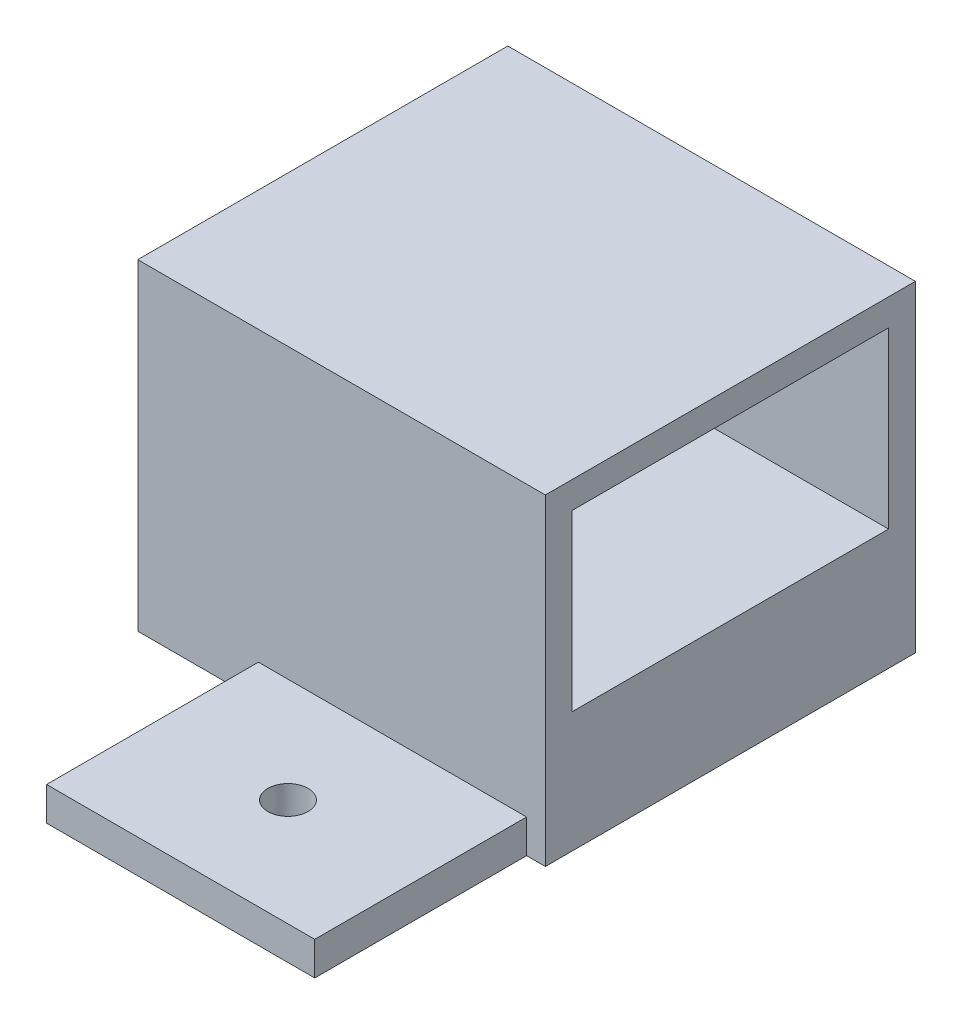
ISO-10303-21;
HEADER;
FILE_DESCRIPTION(('STEP AP214'),'2;1');
FILE_NAME('part.step','',(''),(''),'','','');
FILE_SCHEMA(('AUTOMOTIVE_DESIGN { 1 0 10303 214 1 1 1 1 }'));
ENDSEC;
DATA;
#1=APPLICATION_CONTEXT('core data for automotive mechanical design processes');
#2=APPLICATION_PROTOCOL_DEFINITION('international standard','automotive_design',2000,#1);
#3=PRODUCT_CONTEXT('',#1,'mechanical');
#4=PRODUCT('Part','Part','',(#3));
#5=PRODUCT_RELATED_PRODUCT_CATEGORY('part','',(#4));
#6=PRODUCT_DEFINITION_FORMATION('','',#4);
#7=PRODUCT_DEFINITION_CONTEXT('part definition',#1,'design');
#8=PRODUCT_DEFINITION('design','',#6,#7);
#9=PRODUCT_DEFINITION_SHAPE('','',#8);
#10=(LENGTH_UNIT() NAMED_UNIT(*) SI_UNIT(.MILLI.,.METRE.));
#11=(NAMED_UNIT(*) PLANE_ANGLE_UNIT() SI_UNIT($,.RADIAN.));
#12=(NAMED_UNIT(*) SI_UNIT($,.STERADIAN.) SOLID_ANGLE_UNIT());
#13=UNCERTAINTY_MEASURE_WITH_UNIT(LENGTH_MEASURE(1.E-05),#10,'distance_accuracy_value','');
#14=(GEOMETRIC_REPRESENTATION_CONTEXT(3) GLOBAL_UNCERTAINTY_ASSIGNED_CONTEXT((#13)) GLOBAL_UNIT_ASSIGNED_CONTEXT((#10,
#11,#12)) REPRESENTATION_CONTEXT('',''));
#15=CARTESIAN_POINT('',(0.,0.,0.));
#16=DIRECTION('',(0.,0.,1.));
#17=DIRECTION('',(1.,0.,0.));
#18=AXIS2_PLACEMENT_3D('',#15,#16,#17);
#19=CARTESIAN_POINT('',(0.,0.,-35.4));
#20=DIRECTION('',(0.,0.,1.));
#21=DIRECTION('',(1.,0.,0.));
#22=AXIS2_PLACEMENT_3D('',#19,#20,#21);
#23=PLANE('',#22);
#24=DIRECTION('',(0.,-1.,0.));
#25=VECTOR('',#24,1.);
#26=CARTESIAN_POINT('',(-19.,25.5,-35.4));
#27=LINE('',#26,#25);
#28=CARTESIAN_POINT('',(-19.,25.5,-35.4));
#29=VERTEX_POINT('',#28);
#30=CARTESIAN_POINT('',(-19.,1.5,-35.4));
#31=VERTEX_POINT('',#30);
#32=EDGE_CURVE('E198',#29,#31,#27,.T.);
#33=ORIENTED_EDGE('',*,*,#32,.F.);
#34=DIRECTION('',(-1.,0.,0.));
#35=VECTOR('',#34,1.);
#36=CARTESIAN_POINT('',(11.4,25.5,-35.4));
#37=LINE('',#36,#35);
#38=CARTESIAN_POINT('',(11.4,25.5,-35.4));
#39=VERTEX_POINT('',#38);
#40=EDGE_CURVE('E203',#39,#29,#37,.T.);
#41=ORIENTED_EDGE('',*,*,#40,.F.);
#42=DIRECTION('',(0.,1.,0.));
#43=VECTOR('',#42,1.);
#44=CARTESIAN_POINT('',(11.4,1.5,-35.4));
#45=LINE('',#44,#43);
#46=CARTESIAN_POINT('',(11.4,1.5,-35.4));
#47=VERTEX_POINT('',#46);
#48=EDGE_CURVE('E213',#47,#39,#45,.T.);
#49=ORIENTED_EDGE('',*,*,#48,.F.);
#50=DIRECTION('',(1.,0.,0.));
#51=VECTOR('',#50,1.);
#52=CARTESIAN_POINT('',(-19.,1.5,-35.4));
#53=LINE('',#52,#51);
#54=EDGE_CURVE('E211',#31,#47,#53,.T.);
#55=ORIENTED_EDGE('',*,*,#54,.F.);
#56=EDGE_LOOP('',(#33,#41,#49,#55));
#57=FACE_BOUND('',#56,.T.);
#58=DIRECTION('',(0.,1.,0.));
#59=VECTOR('',#58,1.);
#60=CARTESIAN_POINT('',(-15.,0.,-35.4));
#61=LINE('',#60,#59);
#62=CARTESIAN_POINT('',(-15.,4.5,-35.4));
#63=VERTEX_POINT('',#62);
#64=CARTESIAN_POINT('',(-15.,8.5,-35.4));
#65=VERTEX_POINT('',#64);
#66=EDGE_CURVE('E11',#63,#65,#61,.T.);
#67=ORIENTED_EDGE('',*,*,#66,.F.);
#68=DIRECTION('',(-1.,0.,0.));
#69=VECTOR('',#68,1.);
#70=CARTESIAN_POINT('',(0.,4.5,-35.4));
#71=LINE('',#70,#69);
#72=CARTESIAN_POINT('',(8.,4.5,-35.4));
#73=VERTEX_POINT('',#72);
#74=EDGE_CURVE('E48',#73,#63,#71,.T.);
#75=ORIENTED_EDGE('',*,*,#74,.F.);
#76=DIRECTION('',(0.,-1.,0.));
#77=VECTOR('',#76,1.);
#78=CARTESIAN_POINT('',(8.,0.,-35.4));
#79=LINE('',#78,#77);
#80=CARTESIAN_POINT('',(8.,8.5,-35.4));
#81=VERTEX_POINT('',#80);
#82=EDGE_CURVE('E267',#81,#73,#79,.T.);
#83=ORIENTED_EDGE('',*,*,#82,.F.);
#84=DIRECTION('',(1.,0.,0.));
#85=VECTOR('',#84,1.);
#86=CARTESIAN_POINT('',(0.,8.5,-35.4));
#87=LINE('',#86,#85);
#88=EDGE_CURVE('E270',#65,#81,#87,.T.);
#89=ORIENTED_EDGE('',*,*,#88,.F.);
#90=EDGE_LOOP('',(#67,#75,#83,#89));
#91=FACE_BOUND('',#90,.T.);
#92=ADVANCED_FACE('F39',(#57,#91),#23,.F.);
#93=CARTESIAN_POINT('',(-10.,4.,8.));
#94=DIRECTION('',(1.,0.,0.));
#95=DIRECTION('',(0.,0.,-1.));
#96=AXIS2_PLACEMENT_3D('',#93,#94,#95);
#97=PLANE('',#96);
#98=DIRECTION('',(0.,0.,-1.));
#99=VECTOR('',#98,1.);
#100=CARTESIAN_POINT('',(-10.,4.,8.));
#101=LINE('',#100,#99);
#102=CARTESIAN_POINT('',(-10.,4.,8.));
#103=VERTEX_POINT('',#102);
#104=CARTESIAN_POINT('',(-10.,4.,-7.8));
#105=VERTEX_POINT('',#104);
#106=EDGE_CURVE('E244',#103,#105,#101,.T.);
#107=ORIENTED_EDGE('',*,*,#106,.T.);
#108=DIRECTION('',(0.,-1.,0.));
#109=VECTOR('',#108,1.);
#110=CARTESIAN_POINT('',(-10.,4.,-7.8));
#111=LINE('',#110,#109);
#112=CARTESIAN_POINT('',(-10.,1.5,-7.8));
#113=VERTEX_POINT('',#112);
#114=EDGE_CURVE('E226',#105,#113,#111,.T.);
#115=ORIENTED_EDGE('',*,*,#114,.T.);
#116=DIRECTION('',(0.,0.,-1.));
#117=VECTOR('',#116,1.);
#118=CARTESIAN_POINT('',(-10.,1.5,8.));
#119=LINE('',#118,#117);
#120=CARTESIAN_POINT('',(-10.,1.5,8.));
#121=VERTEX_POINT('',#120);
#122=EDGE_CURVE('E253',#121,#113,#119,.T.);
#123=ORIENTED_EDGE('',*,*,#122,.F.);
#124=DIRECTION('',(0.,-1.,0.));
#125=VECTOR('',#124,1.);
#126=CARTESIAN_POINT('',(-10.,4.,8.));
#127=LINE('',#126,#125);
#128=EDGE_CURVE('E234',#103,#121,#127,.T.);
#129=ORIENTED_EDGE('',*,*,#128,.F.);
#130=EDGE_LOOP('',(#107,#115,#123,#129));
#131=FACE_BOUND('',#130,.T.);
#132=ADVANCED_FACE('F41',(#131),#97,.F.);
#133=CARTESIAN_POINT('',(-10.,1.5,8.));
#134=DIRECTION('',(0.,1.,0.));
#135=DIRECTION('',(0.,0.,1.));
#136=AXIS2_PLACEMENT_3D('',#133,#134,#135);
#137=PLANE('',#136);
#138=CARTESIAN_POINT('',(0.,1.5,0.));
#139=DIRECTION('',(0.,1.,0.));
#140=DIRECTION('',(0.,0.,1.));
#141=AXIS2_PLACEMENT_3D('',#138,#139,#140);
#142=CIRCLE('',#141,1.5);
#143=CARTESIAN_POINT('',(0.,1.5,-1.5));
#144=VERTEX_POINT('',#143);
#145=EDGE_CURVE('E169',#144,#144,#142,.F.);
#146=ORIENTED_EDGE('',*,*,#145,.F.);
#147=EDGE_LOOP('',(#146));
#148=FACE_BOUND('',#147,.T.);
#149=ORIENTED_EDGE('',*,*,#122,.T.);
#150=DIRECTION('',(1.,0.,0.));
#151=VECTOR('',#150,1.);
#152=CARTESIAN_POINT('',(-19.,1.5,-7.8));
#153=LINE('',#152,#151);
#154=CARTESIAN_POINT('',(-19.,1.5,-7.8));
#155=VERTEX_POINT('',#154);
#156=EDGE_CURVE('E205',#155,#113,#153,.T.);
#157=ORIENTED_EDGE('',*,*,#156,.F.);
#158=DIRECTION('',(0.,0.,-1.));
#159=VECTOR('',#158,1.);
#160=CARTESIAN_POINT('',(-19.,1.5,-7.8));
#161=LINE('',#160,#159);
#162=EDGE_CURVE('E221',#155,#31,#161,.T.);
#163=ORIENTED_EDGE('',*,*,#162,.T.);
#164=ORIENTED_EDGE('',*,*,#54,.T.);
#165=DIRECTION('',(0.,0.,-1.));
#166=VECTOR('',#165,1.);
#167=CARTESIAN_POINT('',(11.4,1.5,-7.8));
#168=LINE('',#167,#166);
#169=CARTESIAN_POINT('',(11.4,1.5,-7.8));
#170=VERTEX_POINT('',#169);
#171=EDGE_CURVE('E222',#170,#47,#168,.T.);
#172=ORIENTED_EDGE('',*,*,#171,.F.);
#173=CARTESIAN_POINT('',(9.99999999999999,1.5,-7.8));
#174=VERTEX_POINT('',#173);
#175=EDGE_CURVE('E199',#174,#170,#153,.T.);
#176=ORIENTED_EDGE('',*,*,#175,.F.);
#177=DIRECTION('',(0.,0.,-1.));
#178=VECTOR('',#177,1.);
#179=CARTESIAN_POINT('',(10.,1.5,8.));
#180=LINE('',#179,#178);
#181=CARTESIAN_POINT('',(10.,1.5,8.));
#182=VERTEX_POINT('',#181);
#183=EDGE_CURVE('E249',#182,#174,#180,.T.);
#184=ORIENTED_EDGE('',*,*,#183,.F.);
#185=DIRECTION('',(1.,0.,0.));
#186=VECTOR('',#185,1.);
#187=CARTESIAN_POINT('',(-10.,1.5,8.));
#188=LINE('',#187,#186);
#189=EDGE_CURVE('E237',#121,#182,#188,.T.);
#190=ORIENTED_EDGE('',*,*,#189,.F.);
#191=EDGE_LOOP('',(#149,#157,#163,#164,#172,#176,#184,#190));
#192=FACE_BOUND('',#191,.T.);
#193=ADVANCED_FACE('F310',(#148,#192),#137,.F.);
#194=CARTESIAN_POINT('',(10.,1.5,8.));
#195=DIRECTION('',(-1.,0.,0.));
#196=DIRECTION('',(0.,0.,1.));
#197=AXIS2_PLACEMENT_3D('',#194,#195,#196);
#198=PLANE('',#197);
#199=ORIENTED_EDGE('',*,*,#183,.T.);
#200=DIRECTION('',(0.,1.,0.));
#201=VECTOR('',#200,1.);
#202=CARTESIAN_POINT('',(10.,1.5,-7.8));
#203=LINE('',#202,#201);
#204=CARTESIAN_POINT('',(10.,4.,-7.8));
#205=VERTEX_POINT('',#204);
#206=EDGE_CURVE('E229',#174,#205,#203,.T.);
#207=ORIENTED_EDGE('',*,*,#206,.T.);
#208=DIRECTION('',(0.,0.,-1.));
#209=VECTOR('',#208,1.);
#210=CARTESIAN_POINT('',(10.,4.,8.));
#211=LINE('',#210,#209);
#212=CARTESIAN_POINT('',(10.,4.,8.));
#213=VERTEX_POINT('',#212);
#214=EDGE_CURVE('E241',#213,#205,#211,.T.);
#215=ORIENTED_EDGE('',*,*,#214,.F.);
#216=DIRECTION('',(0.,1.,0.));
#217=VECTOR('',#216,1.);
#218=CARTESIAN_POINT('',(10.,1.5,8.));
#219=LINE('',#218,#217);
#220=EDGE_CURVE('E236',#182,#213,#219,.T.);
#221=ORIENTED_EDGE('',*,*,#220,.F.);
#222=EDGE_LOOP('',(#199,#207,#215,#221));
#223=FACE_BOUND('',#222,.T.);
#224=ADVANCED_FACE('F298',(#223),#198,.F.);
#225=CARTESIAN_POINT('',(10.,4.,8.));
#226=DIRECTION('',(0.,-1.,0.));
#227=DIRECTION('',(0.,0.,-1.));
#228=AXIS2_PLACEMENT_3D('',#225,#226,#227);
#229=PLANE('',#228);
#230=CARTESIAN_POINT('',(0.,4.,0.));
#231=DIRECTION('',(0.,-1.,0.));
#232=DIRECTION('',(0.,0.,-1.));
#233=AXIS2_PLACEMENT_3D('',#230,#231,#232);
#234=CIRCLE('',#233,1.5);
#235=CARTESIAN_POINT('',(0.,4.,-1.5));
#236=VERTEX_POINT('',#235);
#237=EDGE_CURVE('E43',#236,#236,#234,.F.);
#238=ORIENTED_EDGE('',*,*,#237,.F.);
#239=EDGE_LOOP('',(#238));
#240=FACE_BOUND('',#239,.T.);
#241=ORIENTED_EDGE('',*,*,#214,.T.);
#242=DIRECTION('',(-1.,0.,0.));
#243=VECTOR('',#242,1.);
#244=CARTESIAN_POINT('',(10.,4.,-7.8));
#245=LINE('',#244,#243);
#246=EDGE_CURVE('E255',#205,#105,#245,.T.);
#247=ORIENTED_EDGE('',*,*,#246,.T.);
#248=ORIENTED_EDGE('',*,*,#106,.F.);
#249=DIRECTION('',(-1.,0.,0.));
#250=VECTOR('',#249,1.);
#251=CARTESIAN_POINT('',(10.,4.,8.));
#252=LINE('',#251,#250);
#253=EDGE_CURVE('E238',#213,#103,#252,.T.);
#254=ORIENTED_EDGE('',*,*,#253,.F.);
#255=EDGE_LOOP('',(#241,#247,#248,#254));
#256=FACE_BOUND('',#255,.T.);
#257=ADVANCED_FACE('F295',(#240,#256),#229,.F.);
#258=CARTESIAN_POINT('',(0.,0.,8.));
#259=DIRECTION('',(0.,0.,1.));
#260=DIRECTION('',(1.,0.,0.));
#261=AXIS2_PLACEMENT_3D('',#258,#259,#260);
#262=PLANE('',#261);
#263=ORIENTED_EDGE('',*,*,#128,.T.);
#264=ORIENTED_EDGE('',*,*,#189,.T.);
#265=ORIENTED_EDGE('',*,*,#220,.T.);
#266=ORIENTED_EDGE('',*,*,#253,.T.);
#267=EDGE_LOOP('',(#263,#264,#265,#266));
#268=FACE_BOUND('',#267,.T.);
#269=ADVANCED_FACE('F293',(#268),#262,.T.);
#270=CARTESIAN_POINT('',(0.,0.,-7.8));
#271=DIRECTION('',(0.,0.,1.));
#272=DIRECTION('',(1.,0.,0.));
#273=AXIS2_PLACEMENT_3D('',#270,#271,#272);
#274=PLANE('',#273);
#275=ORIENTED_EDGE('',*,*,#114,.F.);
#276=ORIENTED_EDGE('',*,*,#246,.F.);
#277=ORIENTED_EDGE('',*,*,#206,.F.);
#278=ORIENTED_EDGE('',*,*,#175,.T.);
#279=DIRECTION('',(0.,1.,0.));
#280=VECTOR('',#279,1.);
#281=CARTESIAN_POINT('',(11.4,1.5,-7.8));
#282=LINE('',#281,#280);
#283=CARTESIAN_POINT('',(11.4,25.5,-7.8));
#284=VERTEX_POINT('',#283);
#285=EDGE_CURVE('E204',#170,#284,#282,.T.);
#286=ORIENTED_EDGE('',*,*,#285,.T.);
#287=DIRECTION('',(-1.,0.,0.));
#288=VECTOR('',#287,1.);
#289=CARTESIAN_POINT('',(11.4,25.5,-7.8));
#290=LINE('',#289,#288);
#291=CARTESIAN_POINT('',(-19.,25.5,-7.8));
#292=VERTEX_POINT('',#291);
#293=EDGE_CURVE('E206',#284,#292,#290,.T.);
#294=ORIENTED_EDGE('',*,*,#293,.T.);
#295=DIRECTION('',(0.,-1.,0.));
#296=VECTOR('',#295,1.);
#297=CARTESIAN_POINT('',(-19.,25.5,-7.8));
#298=LINE('',#297,#296);
#299=EDGE_CURVE('E197',#292,#155,#298,.T.);
#300=ORIENTED_EDGE('',*,*,#299,.T.);
#301=ORIENTED_EDGE('',*,*,#156,.T.);
#302=EDGE_LOOP('',(#275,#276,#277,#278,#286,#294,#300,#301));
#303=FACE_BOUND('',#302,.T.);
#304=ADVANCED_FACE('F308',(#303),#274,.T.);
#305=CARTESIAN_POINT('',(-19.,25.5,-7.8));
#306=DIRECTION('',(1.,0.,0.));
#307=DIRECTION('',(0.,0.,-1.));
#308=AXIS2_PLACEMENT_3D('',#305,#306,#307);
#309=PLANE('',#308);
#310=DIRECTION('',(0.,0.,-1.));
#311=VECTOR('',#310,1.);
#312=CARTESIAN_POINT('',(-19.,23.5,-7.8));
#313=LINE('',#312,#311);
#314=CARTESIAN_POINT('',(-19.,23.5,-9.8));
#315=VERTEX_POINT('',#314);
#316=CARTESIAN_POINT('',(-19.,23.5,-33.4));
#317=VERTEX_POINT('',#316);
#318=EDGE_CURVE('E192',#315,#317,#313,.T.);
#319=ORIENTED_EDGE('',*,*,#318,.F.);
#320=DIRECTION('',(0.,-1.,0.));
#321=VECTOR('',#320,1.);
#322=CARTESIAN_POINT('',(-19.,25.5,-9.8));
#323=LINE('',#322,#321);
#324=CARTESIAN_POINT('',(-19.,10.5,-9.8));
#325=VERTEX_POINT('',#324);
#326=EDGE_CURVE('E190',#315,#325,#323,.T.);
#327=ORIENTED_EDGE('',*,*,#326,.T.);
#328=DIRECTION('',(0.,0.,1.));
#329=VECTOR('',#328,1.);
#330=CARTESIAN_POINT('',(-19.,10.5,-7.8));
#331=LINE('',#330,#329);
#332=CARTESIAN_POINT('',(-19.,10.5,-33.4));
#333=VERTEX_POINT('',#332);
#334=EDGE_CURVE('E193',#333,#325,#331,.T.);
#335=ORIENTED_EDGE('',*,*,#334,.F.);
#336=DIRECTION('',(0.,-1.,0.));
#337=VECTOR('',#336,1.);
#338=CARTESIAN_POINT('',(-19.,25.5,-33.4));
#339=LINE('',#338,#337);
#340=EDGE_CURVE('E183',#317,#333,#339,.T.);
#341=ORIENTED_EDGE('',*,*,#340,.F.);
#342=EDGE_LOOP('',(#319,#327,#335,#341));
#343=FACE_BOUND('',#342,.T.);
#344=ORIENTED_EDGE('',*,*,#32,.T.);
#345=ORIENTED_EDGE('',*,*,#162,.F.);
#346=ORIENTED_EDGE('',*,*,#299,.F.);
#347=DIRECTION('',(0.,0.,-1.));
#348=VECTOR('',#347,1.);
#349=CARTESIAN_POINT('',(-19.,25.5,-7.8));
#350=LINE('',#349,#348);
#351=EDGE_CURVE('E208',#292,#29,#350,.T.);
#352=ORIENTED_EDGE('',*,*,#351,.T.);
#353=EDGE_LOOP('',(#344,#345,#346,#352));
#354=FACE_BOUND('',#353,.T.);
#355=ADVANCED_FACE('F322',(#343,#354),#309,.F.);
#356=CARTESIAN_POINT('',(11.4,1.5,-7.8));
#357=DIRECTION('',(-1.,0.,0.));
#358=DIRECTION('',(0.,0.,1.));
#359=AXIS2_PLACEMENT_3D('',#356,#357,#358);
#360=PLANE('',#359);
#361=DIRECTION('',(0.,0.,-1.));
#362=VECTOR('',#361,1.);
#363=CARTESIAN_POINT('',(11.4,10.5,-7.8));
#364=LINE('',#363,#362);
#365=CARTESIAN_POINT('',(11.4,10.5,-9.8));
#366=VERTEX_POINT('',#365);
#367=CARTESIAN_POINT('',(11.4,10.5,-33.4));
#368=VERTEX_POINT('',#367);
#369=EDGE_CURVE('E261',#366,#368,#364,.T.);
#370=ORIENTED_EDGE('',*,*,#369,.F.);
#371=DIRECTION('',(0.,1.,0.));
#372=VECTOR('',#371,1.);
#373=CARTESIAN_POINT('',(11.4,1.5,-9.8));
#374=LINE('',#373,#372);
#375=CARTESIAN_POINT('',(11.4,23.5,-9.8));
#376=VERTEX_POINT('',#375);
#377=EDGE_CURVE('E262',#366,#376,#374,.T.);
#378=ORIENTED_EDGE('',*,*,#377,.T.);
#379=DIRECTION('',(0.,0.,1.));
#380=VECTOR('',#379,1.);
#381=CARTESIAN_POINT('',(11.4,23.5,-7.8));
#382=LINE('',#381,#380);
#383=CARTESIAN_POINT('',(11.4,23.5,-33.4));
#384=VERTEX_POINT('',#383);
#385=EDGE_CURVE('E259',#384,#376,#382,.T.);
#386=ORIENTED_EDGE('',*,*,#385,.F.);
#387=DIRECTION('',(0.,1.,0.));
#388=VECTOR('',#387,1.);
#389=CARTESIAN_POINT('',(11.4,1.5,-33.4));
#390=LINE('',#389,#388);
#391=EDGE_CURVE('E260',#368,#384,#390,.T.);
#392=ORIENTED_EDGE('',*,*,#391,.F.);
#393=EDGE_LOOP('',(#370,#378,#386,#392));
#394=FACE_BOUND('',#393,.T.);
#395=ORIENTED_EDGE('',*,*,#48,.T.);
#396=DIRECTION('',(0.,0.,-1.));
#397=VECTOR('',#396,1.);
#398=CARTESIAN_POINT('',(11.4,25.5,-7.8));
#399=LINE('',#398,#397);
#400=EDGE_CURVE('E217',#284,#39,#399,.T.);
#401=ORIENTED_EDGE('',*,*,#400,.F.);
#402=ORIENTED_EDGE('',*,*,#285,.F.);
#403=ORIENTED_EDGE('',*,*,#171,.T.);
#404=EDGE_LOOP('',(#395,#401,#402,#403));
#405=FACE_BOUND('',#404,.T.);
#406=ADVANCED_FACE('F314',(#394,#405),#360,.F.);
#407=CARTESIAN_POINT('',(11.4,25.5,-7.8));
#408=DIRECTION('',(0.,-1.,0.));
#409=DIRECTION('',(0.,0.,-1.));
#410=AXIS2_PLACEMENT_3D('',#407,#408,#409);
#411=PLANE('',#410);
#412=ORIENTED_EDGE('',*,*,#40,.T.);
#413=ORIENTED_EDGE('',*,*,#351,.F.);
#414=ORIENTED_EDGE('',*,*,#293,.F.);
#415=ORIENTED_EDGE('',*,*,#400,.T.);
#416=EDGE_LOOP('',(#412,#413,#414,#415));
#417=FACE_BOUND('',#416,.T.);
#418=ADVANCED_FACE('F319',(#417),#411,.F.);
#419=CARTESIAN_POINT('',(-19.1,10.5,-9.8));
#420=DIRECTION('',(0.,1.,0.));
#421=DIRECTION('',(0.,0.,1.));
#422=AXIS2_PLACEMENT_3D('',#419,#420,#421);
#423=PLANE('',#422);
#424=ORIENTED_EDGE('',*,*,#334,.T.);
#425=DIRECTION('',(1.,0.,0.));
#426=VECTOR('',#425,1.);
#427=CARTESIAN_POINT('',(-19.1,10.5,-9.8));
#428=LINE('',#427,#426);
#429=EDGE_CURVE('E180',#325,#366,#428,.T.);
#430=ORIENTED_EDGE('',*,*,#429,.T.);
#431=ORIENTED_EDGE('',*,*,#369,.T.);
#432=DIRECTION('',(1.,0.,0.));
#433=VECTOR('',#432,1.);
#434=CARTESIAN_POINT('',(-19.1,10.5,-33.4));
#435=LINE('',#434,#433);
#436=EDGE_CURVE('E174',#333,#368,#435,.T.);
#437=ORIENTED_EDGE('',*,*,#436,.F.);
#438=EDGE_LOOP('',(#424,#430,#431,#437));
#439=FACE_BOUND('',#438,.T.);
#440=ADVANCED_FACE('F346',(#439),#423,.T.);
#441=CARTESIAN_POINT('',(11.5,23.5,-9.8));
#442=DIRECTION('',(0.,-1.,0.));
#443=DIRECTION('',(0.,0.,-1.));
#444=AXIS2_PLACEMENT_3D('',#441,#442,#443);
#445=PLANE('',#444);
#446=ORIENTED_EDGE('',*,*,#318,.T.);
#447=DIRECTION('',(-1.,0.,0.));
#448=VECTOR('',#447,1.);
#449=CARTESIAN_POINT('',(11.5,23.5,-33.4));
#450=LINE('',#449,#448);
#451=EDGE_CURVE('E64',#384,#317,#450,.T.);
#452=ORIENTED_EDGE('',*,*,#451,.F.);
#453=ORIENTED_EDGE('',*,*,#385,.T.);
#454=DIRECTION('',(-1.,0.,0.));
#455=VECTOR('',#454,1.);
#456=CARTESIAN_POINT('',(11.5,23.5,-9.8));
#457=LINE('',#456,#455);
#458=EDGE_CURVE('E181',#376,#315,#457,.T.);
#459=ORIENTED_EDGE('',*,*,#458,.T.);
#460=EDGE_LOOP('',(#446,#452,#453,#459));
#461=FACE_BOUND('',#460,.T.);
#462=ADVANCED_FACE('F358',(#461),#445,.T.);
#463=CARTESIAN_POINT('',(0.,0.,-9.8));
#464=DIRECTION('',(0.,0.,1.));
#465=DIRECTION('',(1.,0.,0.));
#466=AXIS2_PLACEMENT_3D('',#463,#464,#465);
#467=PLANE('',#466);
#468=ORIENTED_EDGE('',*,*,#458,.F.);
#469=ORIENTED_EDGE('',*,*,#377,.F.);
#470=ORIENTED_EDGE('',*,*,#429,.F.);
#471=ORIENTED_EDGE('',*,*,#326,.F.);
#472=EDGE_LOOP('',(#468,#469,#470,#471));
#473=FACE_BOUND('',#472,.T.);
#474=ADVANCED_FACE('F361',(#473),#467,.F.);
#475=CARTESIAN_POINT('',(0.,0.,-33.4));
#476=DIRECTION('',(0.,0.,1.));
#477=DIRECTION('',(1.,0.,0.));
#478=AXIS2_PLACEMENT_3D('',#475,#476,#477);
#479=PLANE('',#478);
#480=ORIENTED_EDGE('',*,*,#340,.T.);
#481=ORIENTED_EDGE('',*,*,#436,.T.);
#482=ORIENTED_EDGE('',*,*,#391,.T.);
#483=ORIENTED_EDGE('',*,*,#451,.T.);
#484=EDGE_LOOP('',(#480,#481,#482,#483));
#485=FACE_BOUND('',#484,.T.);
#486=ADVANCED_FACE('F369',(#485),#479,.T.);
#487=CARTESIAN_POINT('',(-15.,8.5,-11.8));
#488=DIRECTION('',(1.,0.,0.));
#489=DIRECTION('',(0.,0.,-1.));
#490=AXIS2_PLACEMENT_3D('',#487,#488,#489);
#491=PLANE('',#490);
#492=ORIENTED_EDGE('',*,*,#66,.T.);
#493=DIRECTION('',(0.,0.,-1.));
#494=VECTOR('',#493,1.);
#495=CARTESIAN_POINT('',(-15.,8.5,-11.8));
#496=LINE('',#495,#494);
#497=CARTESIAN_POINT('',(-15.,8.5,-11.8));
#498=VERTEX_POINT('',#497);
#499=EDGE_CURVE('E54',#498,#65,#496,.T.);
#500=ORIENTED_EDGE('',*,*,#499,.F.);
#501=DIRECTION('',(0.,-1.,0.));
#502=VECTOR('',#501,1.);
#503=CARTESIAN_POINT('',(-15.,8.5,-11.8));
#504=LINE('',#503,#502);
#505=CARTESIAN_POINT('',(-15.,4.5,-11.8));
#506=VERTEX_POINT('',#505);
#507=EDGE_CURVE('E156',#498,#506,#504,.T.);
#508=ORIENTED_EDGE('',*,*,#507,.T.);
#509=DIRECTION('',(0.,0.,-1.));
#510=VECTOR('',#509,1.);
#511=CARTESIAN_POINT('',(-15.,4.5,-11.8));
#512=LINE('',#511,#510);
#513=EDGE_CURVE('E167',#506,#63,#512,.T.);
#514=ORIENTED_EDGE('',*,*,#513,.T.);
#515=EDGE_LOOP('',(#492,#500,#508,#514));
#516=FACE_BOUND('',#515,.T.);
#517=ADVANCED_FACE('F164',(#516),#491,.T.);
#518=CARTESIAN_POINT('',(-15.,4.5,-11.8));
#519=DIRECTION('',(0.,1.,0.));
#520=DIRECTION('',(0.,0.,1.));
#521=AXIS2_PLACEMENT_3D('',#518,#519,#520);
#522=PLANE('',#521);
#523=ORIENTED_EDGE('',*,*,#74,.T.);
#524=ORIENTED_EDGE('',*,*,#513,.F.);
#525=DIRECTION('',(1.,0.,0.));
#526=VECTOR('',#525,1.);
#527=CARTESIAN_POINT('',(-15.,4.5,-11.8));
#528=LINE('',#527,#526);
#529=CARTESIAN_POINT('',(8.,4.5,-11.8));
#530=VERTEX_POINT('',#529);
#531=EDGE_CURVE('E155',#506,#530,#528,.T.);
#532=ORIENTED_EDGE('',*,*,#531,.T.);
#533=DIRECTION('',(0.,0.,-1.));
#534=VECTOR('',#533,1.);
#535=CARTESIAN_POINT('',(8.,4.5,-11.8));
#536=LINE('',#535,#534);
#537=EDGE_CURVE('E172',#530,#73,#536,.T.);
#538=ORIENTED_EDGE('',*,*,#537,.T.);
#539=EDGE_LOOP('',(#523,#524,#532,#538));
#540=FACE_BOUND('',#539,.T.);
#541=ADVANCED_FACE('F168',(#540),#522,.T.);
#542=CARTESIAN_POINT('',(8.,4.5,-11.8));
#543=DIRECTION('',(-1.,0.,0.));
#544=DIRECTION('',(0.,0.,1.));
#545=AXIS2_PLACEMENT_3D('',#542,#543,#544);
#546=PLANE('',#545);
#547=ORIENTED_EDGE('',*,*,#82,.T.);
#548=ORIENTED_EDGE('',*,*,#537,.F.);
#549=DIRECTION('',(0.,1.,0.));
#550=VECTOR('',#549,1.);
#551=CARTESIAN_POINT('',(8.,4.5,-11.8));
#552=LINE('',#551,#550);
#553=CARTESIAN_POINT('',(8.,8.5,-11.8));
#554=VERTEX_POINT('',#553);
#555=EDGE_CURVE('E160',#530,#554,#552,.T.);
#556=ORIENTED_EDGE('',*,*,#555,.T.);
#557=DIRECTION('',(0.,0.,-1.));
#558=VECTOR('',#557,1.);
#559=CARTESIAN_POINT('',(8.,8.5,-11.8));
#560=LINE('',#559,#558);
#561=EDGE_CURVE('E176',#554,#81,#560,.T.);
#562=ORIENTED_EDGE('',*,*,#561,.T.);
#563=EDGE_LOOP('',(#547,#548,#556,#562));
#564=FACE_BOUND('',#563,.T.);
#565=ADVANCED_FACE('F273',(#564),#546,.T.);
#566=CARTESIAN_POINT('',(8.,8.5,-11.8));
#567=DIRECTION('',(0.,-1.,0.));
#568=DIRECTION('',(0.,0.,-1.));
#569=AXIS2_PLACEMENT_3D('',#566,#567,#568);
#570=PLANE('',#569);
#571=ORIENTED_EDGE('',*,*,#88,.T.);
#572=ORIENTED_EDGE('',*,*,#561,.F.);
#573=DIRECTION('',(-1.,0.,0.));
#574=VECTOR('',#573,1.);
#575=CARTESIAN_POINT('',(8.,8.5,-11.8));
#576=LINE('',#575,#574);
#577=EDGE_CURVE('E276',#554,#498,#576,.T.);
#578=ORIENTED_EDGE('',*,*,#577,.T.);
#579=ORIENTED_EDGE('',*,*,#499,.T.);
#580=EDGE_LOOP('',(#571,#572,#578,#579));
#581=FACE_BOUND('',#580,.T.);
#582=ADVANCED_FACE('F279',(#581),#570,.T.);
#583=CARTESIAN_POINT('',(0.,0.,-11.8));
#584=DIRECTION('',(0.,0.,1.));
#585=DIRECTION('',(1.,0.,0.));
#586=AXIS2_PLACEMENT_3D('',#583,#584,#585);
#587=PLANE('',#586);
#588=ORIENTED_EDGE('',*,*,#507,.F.);
#589=ORIENTED_EDGE('',*,*,#577,.F.);
#590=ORIENTED_EDGE('',*,*,#555,.F.);
#591=ORIENTED_EDGE('',*,*,#531,.F.);
#592=EDGE_LOOP('',(#588,#589,#590,#591));
#593=FACE_BOUND('',#592,.T.);
#594=ADVANCED_FACE('F152',(#593),#587,.F.);
#595=CARTESIAN_POINT('',(0.,4.1,0.));
#596=DIRECTION('',(0.,-1.,0.));
#597=DIRECTION('',(0.,0.,-1.));
#598=AXIS2_PLACEMENT_3D('',#595,#596,#597);
#599=CYLINDRICAL_SURFACE('',#598,1.5);
#600=CARTESIAN_POINT('',(0.,4.,-1.5));
#601=CARTESIAN_POINT('',(0.,3.97395833333333,-1.5));
#602=CARTESIAN_POINT('',(0.,3.94791666666667,-1.5));
#603=CARTESIAN_POINT('',(0.,3.89583333333333,-1.5));
#604=CARTESIAN_POINT('',(0.,3.86979166666667,-1.5));
#605=CARTESIAN_POINT('',(0.,3.81770833333333,-1.5));
#606=CARTESIAN_POINT('',(0.,3.79166666666667,-1.5));
#607=CARTESIAN_POINT('',(0.,3.73958333333333,-1.5));
#608=CARTESIAN_POINT('',(0.,3.71354166666667,-1.5));
#609=CARTESIAN_POINT('',(0.,3.66145833333333,-1.5));
#610=CARTESIAN_POINT('',(0.,3.63541666666667,-1.5));
#611=CARTESIAN_POINT('',(0.,3.58333333333333,-1.5));
#612=CARTESIAN_POINT('',(0.,3.55729166666667,-1.5));
#613=CARTESIAN_POINT('',(0.,3.50520833333333,-1.5));
#614=CARTESIAN_POINT('',(0.,3.47916666666667,-1.5));
#615=CARTESIAN_POINT('',(0.,3.42708333333333,-1.5));
#616=CARTESIAN_POINT('',(0.,3.40104166666667,-1.5));
#617=CARTESIAN_POINT('',(0.,3.34895833333333,-1.5));
#618=CARTESIAN_POINT('',(0.,3.32291666666667,-1.5));
#619=CARTESIAN_POINT('',(0.,3.27083333333333,-1.5));
#620=CARTESIAN_POINT('',(0.,3.24479166666667,-1.5));
#621=CARTESIAN_POINT('',(0.,3.19270833333333,-1.5));
#622=CARTESIAN_POINT('',(0.,3.16666666666667,-1.5));
#623=CARTESIAN_POINT('',(0.,3.11458333333333,-1.5));
#624=CARTESIAN_POINT('',(0.,3.08854166666667,-1.5));
#625=CARTESIAN_POINT('',(0.,3.03645833333333,-1.5));
#626=CARTESIAN_POINT('',(0.,3.01041666666667,-1.5));
#627=CARTESIAN_POINT('',(0.,2.95833333333333,-1.5));
#628=CARTESIAN_POINT('',(0.,2.93229166666667,-1.5));
#629=CARTESIAN_POINT('',(0.,2.88020833333333,-1.5));
#630=CARTESIAN_POINT('',(0.,2.85416666666667,-1.5));
#631=CARTESIAN_POINT('',(0.,2.80208333333333,-1.5));
#632=CARTESIAN_POINT('',(0.,2.77604166666667,-1.5));
#633=CARTESIAN_POINT('',(0.,2.72395833333333,-1.5));
#634=CARTESIAN_POINT('',(0.,2.69791666666667,-1.5));
#635=CARTESIAN_POINT('',(0.,2.64583333333333,-1.5));
#636=CARTESIAN_POINT('',(0.,2.61979166666667,-1.5));
#637=CARTESIAN_POINT('',(0.,2.56770833333333,-1.5));
#638=CARTESIAN_POINT('',(0.,2.54166666666667,-1.5));
#639=CARTESIAN_POINT('',(0.,2.48958333333333,-1.5));
#640=CARTESIAN_POINT('',(0.,2.46354166666667,-1.5));
#641=CARTESIAN_POINT('',(0.,2.41145833333333,-1.5));
#642=CARTESIAN_POINT('',(0.,2.38541666666667,-1.5));
#643=CARTESIAN_POINT('',(0.,2.33333333333333,-1.5));
#644=CARTESIAN_POINT('',(0.,2.30729166666667,-1.5));
#645=CARTESIAN_POINT('',(0.,2.25520833333333,-1.5));
#646=CARTESIAN_POINT('',(0.,2.22916666666667,-1.5));
#647=CARTESIAN_POINT('',(0.,2.17708333333333,-1.5));
#648=CARTESIAN_POINT('',(0.,2.15104166666667,-1.5));
#649=CARTESIAN_POINT('',(0.,2.09895833333333,-1.5));
#650=CARTESIAN_POINT('',(0.,2.07291666666667,-1.5));
#651=CARTESIAN_POINT('',(0.,2.02083333333333,-1.5));
#652=CARTESIAN_POINT('',(0.,1.99479166666667,-1.5));
#653=CARTESIAN_POINT('',(0.,1.94270833333333,-1.5));
#654=CARTESIAN_POINT('',(0.,1.91666666666667,-1.5));
#655=CARTESIAN_POINT('',(0.,1.86458333333333,-1.5));
#656=CARTESIAN_POINT('',(0.,1.83854166666667,-1.5));
#657=CARTESIAN_POINT('',(0.,1.78645833333333,-1.5));
#658=CARTESIAN_POINT('',(0.,1.76041666666667,-1.5));
#659=CARTESIAN_POINT('',(0.,1.70833333333333,-1.5));
#660=CARTESIAN_POINT('',(0.,1.68229166666667,-1.5));
#661=CARTESIAN_POINT('',(0.,1.63020833333333,-1.5));
#662=CARTESIAN_POINT('',(0.,1.60416666666667,-1.5));
#663=CARTESIAN_POINT('',(0.,1.55208333333333,-1.5));
#664=CARTESIAN_POINT('',(0.,1.52604166666667,-1.5));
#665=CARTESIAN_POINT('',(0.,1.5,-1.5));
#666=B_SPLINE_CURVE_WITH_KNOTS('',3,(#600,#601,#602,#603,#604,#605,#606,#607,#608,#609,#610,
#611,#612,#613,#614,#615,#616,#617,#618,#619,#620,#621,#622,#623,#624,#625,#626,#627,#628,#629,
#630,#631,#632,#633,#634,#635,#636,#637,#638,#639,#640,#641,#642,#643,#644,#645,#646,#647,#648,
#649,#650,#651,#652,#653,#654,#655,#656,#657,#658,#659,#660,#661,#662,#663,#664,#665),
.UNSPECIFIED.,.F.,.F.,(4,2,2,2,2,2,2,2,2,2,2,2,2,2,2,2,2,2,2,2,2,2,2,2,2,2,2,2,2,2,2,2,4),(0.,
0.0781249999999992,0.15625,0.234375,0.3125,0.390625,0.46875,0.546875,0.625,0.703125,0.78125,
0.859375,0.9375,1.015625,1.09375,1.171875,1.25,1.328125,1.40625,1.484375,1.5625,1.640625,
1.71875,1.796875,1.875,1.953125,2.03125,2.109375,2.1875,2.265625,2.34375,2.421875,2.5),.UNSPECIFIED.);
#667=EDGE_CURVE('BSEAM290',#236,#144,#666,.T.);
#668=ORIENTED_EDGE('',*,*,#237,.T.);
#669=ORIENTED_EDGE('',*,*,#145,.T.);
#670=ORIENTED_EDGE('',*,*,#667,.T.);
#671=ORIENTED_EDGE('',*,*,#667,.F.);
#672=EDGE_LOOP('',(#668,#670,#669,#671));
#673=FACE_BOUND('',#672,.T.);
#674=ADVANCED_FACE('F290',(#673),#599,.F.);
#675=CLOSED_SHELL('',(#92,#132,#193,#224,#257,#269,#304,#355,#406,#418,#440,#462,#474,#486,#517,
#541,#565,#582,#594,#674));
#676=MANIFOLD_SOLID_BREP('B2',#675);
#677=ADVANCED_BREP_SHAPE_REPRESENTATION('',(#18,#676),#14);
#678=SHAPE_DEFINITION_REPRESENTATION(#9,#677);
ENDSEC;
END-ISO-10303-21;
